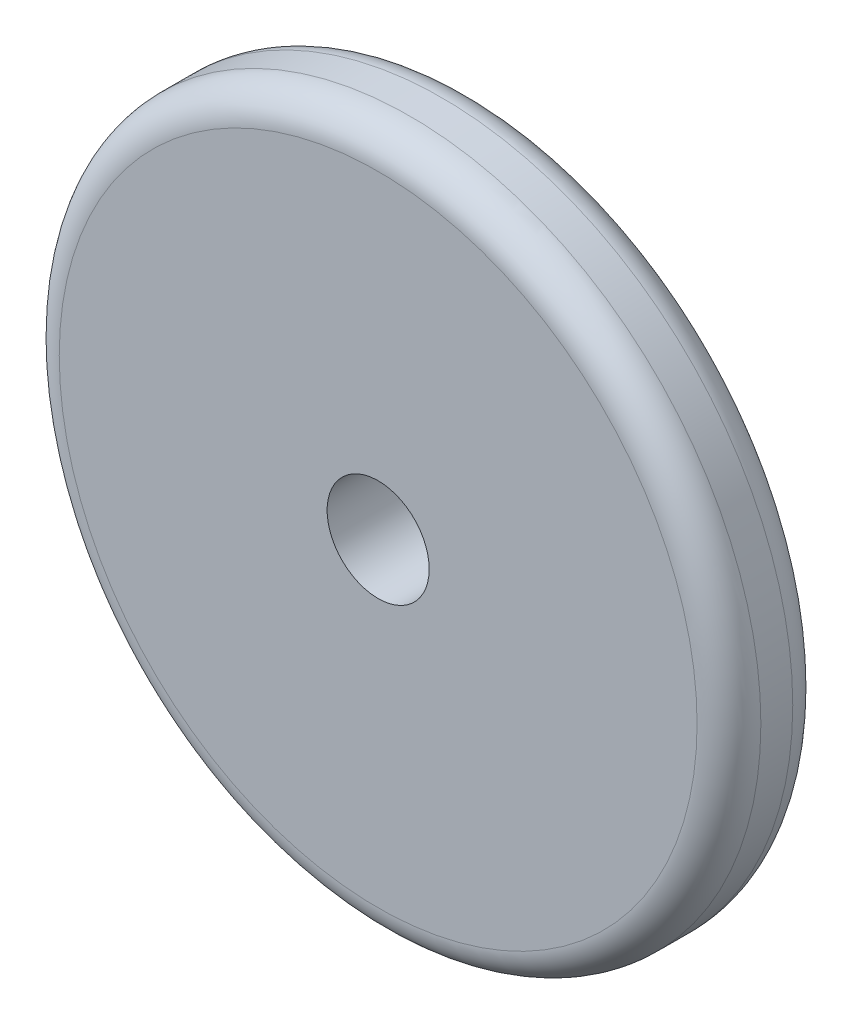
ISO-10303-21;
HEADER;
FILE_DESCRIPTION(('STEP AP214'),'2;1');
FILE_NAME('part.step','',(''),(''),'','','');
FILE_SCHEMA(('AUTOMOTIVE_DESIGN { 1 0 10303 214 1 1 1 1 }'));
ENDSEC;
DATA;
#1=APPLICATION_CONTEXT('core data for automotive mechanical design processes');
#2=APPLICATION_PROTOCOL_DEFINITION('international standard','automotive_design',2000,#1);
#3=PRODUCT_CONTEXT('',#1,'mechanical');
#4=PRODUCT('Part','Part','',(#3));
#5=PRODUCT_RELATED_PRODUCT_CATEGORY('part','',(#4));
#6=PRODUCT_DEFINITION_FORMATION('','',#4);
#7=PRODUCT_DEFINITION_CONTEXT('part definition',#1,'design');
#8=PRODUCT_DEFINITION('design','',#6,#7);
#9=PRODUCT_DEFINITION_SHAPE('','',#8);
#10=(LENGTH_UNIT() NAMED_UNIT(*) SI_UNIT(.MILLI.,.METRE.));
#11=(NAMED_UNIT(*) PLANE_ANGLE_UNIT() SI_UNIT($,.RADIAN.));
#12=(NAMED_UNIT(*) SI_UNIT($,.STERADIAN.) SOLID_ANGLE_UNIT());
#13=UNCERTAINTY_MEASURE_WITH_UNIT(LENGTH_MEASURE(1.E-05),#10,'distance_accuracy_value','');
#14=(GEOMETRIC_REPRESENTATION_CONTEXT(3) GLOBAL_UNCERTAINTY_ASSIGNED_CONTEXT((#13)) GLOBAL_UNIT_ASSIGNED_CONTEXT((#10,
#11,#12)) REPRESENTATION_CONTEXT('',''));
#15=CARTESIAN_POINT('',(0.,0.,0.));
#16=DIRECTION('',(0.,0.,1.));
#17=DIRECTION('',(1.,0.,0.));
#18=AXIS2_PLACEMENT_3D('',#15,#16,#17);
#19=CARTESIAN_POINT('',(0.,0.,3.));
#20=DIRECTION('',(0.,0.,1.));
#21=DIRECTION('',(1.,0.,0.));
#22=AXIS2_PLACEMENT_3D('',#19,#20,#21);
#23=PLANE('',#22);
#24=CARTESIAN_POINT('',(0.,0.,3.));
#25=DIRECTION('',(0.,0.,1.));
#26=DIRECTION('',(1.,0.,0.));
#27=AXIS2_PLACEMENT_3D('',#24,#25,#26);
#28=CIRCLE('',#27,10.);
#29=CARTESIAN_POINT('',(10.,0.,3.));
#30=VERTEX_POINT('',#29);
#31=EDGE_CURVE('E10',#30,#30,#28,.T.);
#32=ORIENTED_EDGE('',*,*,#31,.T.);
#33=EDGE_LOOP('',(#32));
#34=FACE_BOUND('',#33,.T.);
#35=CARTESIAN_POINT('',(0.,0.,3.));
#36=DIRECTION('',(0.,0.,1.));
#37=DIRECTION('',(1.,0.,0.));
#38=AXIS2_PLACEMENT_3D('',#35,#36,#37);
#39=CIRCLE('',#38,1.6);
#40=CARTESIAN_POINT('',(1.6,0.,3.));
#41=VERTEX_POINT('',#40);
#42=EDGE_CURVE('E59',#41,#41,#39,.T.);
#43=ORIENTED_EDGE('',*,*,#42,.F.);
#44=EDGE_LOOP('',(#43));
#45=FACE_BOUND('',#44,.T.);
#46=ADVANCED_FACE('F39',(#34,#45),#23,.T.);
#47=CARTESIAN_POINT('',(0.,0.,0.));
#48=DIRECTION('',(0.,0.,1.));
#49=DIRECTION('',(1.,0.,0.));
#50=AXIS2_PLACEMENT_3D('',#47,#48,#49);
#51=PLANE('',#50);
#52=CARTESIAN_POINT('',(0.,0.,0.));
#53=DIRECTION('',(0.,0.,1.));
#54=DIRECTION('',(1.,0.,0.));
#55=AXIS2_PLACEMENT_3D('',#52,#53,#54);
#56=CIRCLE('',#55,10.);
#57=CARTESIAN_POINT('',(10.,0.,0.));
#58=VERTEX_POINT('',#57);
#59=EDGE_CURVE('E46',#58,#58,#56,.F.);
#60=ORIENTED_EDGE('',*,*,#59,.T.);
#61=EDGE_LOOP('',(#60));
#62=FACE_BOUND('',#61,.T.);
#63=CARTESIAN_POINT('',(0.,0.,0.));
#64=DIRECTION('',(0.,0.,1.));
#65=DIRECTION('',(1.,0.,0.));
#66=AXIS2_PLACEMENT_3D('',#63,#64,#65);
#67=CIRCLE('',#66,1.6);
#68=CARTESIAN_POINT('',(1.6,0.,0.));
#69=VERTEX_POINT('',#68);
#70=EDGE_CURVE('E60',#69,#69,#67,.T.);
#71=ORIENTED_EDGE('',*,*,#70,.T.);
#72=EDGE_LOOP('',(#71));
#73=FACE_BOUND('',#72,.T.);
#74=ADVANCED_FACE('F70',(#62,#73),#51,.F.);
#75=CARTESIAN_POINT('',(0.,0.,3.));
#76=DIRECTION('',(0.,0.,-1.));
#77=DIRECTION('',(-1.,0.,0.));
#78=AXIS2_PLACEMENT_3D('',#75,#76,#77);
#79=CYLINDRICAL_SURFACE('',#78,11.);
#80=CARTESIAN_POINT('',(0.,0.,1.));
#81=DIRECTION('',(0.,0.,1.));
#82=DIRECTION('',(1.,0.,0.));
#83=AXIS2_PLACEMENT_3D('',#80,#81,#82);
#84=CIRCLE('',#83,11.);
#85=CARTESIAN_POINT('',(11.,0.,1.));
#86=VERTEX_POINT('',#85);
#87=EDGE_CURVE('E50',#86,#86,#84,.T.);
#88=ORIENTED_EDGE('',*,*,#87,.T.);
#89=EDGE_LOOP('',(#88));
#90=FACE_BOUND('',#89,.T.);
#91=CARTESIAN_POINT('',(0.,0.,2.));
#92=DIRECTION('',(0.,0.,1.));
#93=DIRECTION('',(1.,0.,0.));
#94=AXIS2_PLACEMENT_3D('',#91,#92,#93);
#95=CIRCLE('',#94,11.);
#96=CARTESIAN_POINT('',(11.,0.,2.));
#97=VERTEX_POINT('',#96);
#98=EDGE_CURVE('E54',#97,#97,#95,.F.);
#99=ORIENTED_EDGE('',*,*,#98,.T.);
#100=EDGE_LOOP('',(#99));
#101=FACE_BOUND('',#100,.T.);
#102=ADVANCED_FACE('F76',(#90,#101),#79,.T.);
#103=CARTESIAN_POINT('',(0.,0.,3.));
#104=DIRECTION('',(0.,0.,-1.));
#105=DIRECTION('',(-1.,0.,0.));
#106=AXIS2_PLACEMENT_3D('',#103,#104,#105);
#107=CYLINDRICAL_SURFACE('',#106,1.6);
#108=ORIENTED_EDGE('',*,*,#42,.T.);
#109=EDGE_LOOP('',(#108));
#110=FACE_BOUND('',#109,.T.);
#111=ORIENTED_EDGE('',*,*,#70,.F.);
#112=EDGE_LOOP('',(#111));
#113=FACE_BOUND('',#112,.T.);
#114=ADVANCED_FACE('F66',(#110,#113),#107,.F.);
#115=CARTESIAN_POINT('',(0.,0.,1.));
#116=DIRECTION('',(0.,0.,1.));
#117=DIRECTION('',(1.,0.,0.));
#118=AXIS2_PLACEMENT_3D('',#115,#116,#117);
#119=TOROIDAL_SURFACE('',#118,10.,1.);
#120=ORIENTED_EDGE('',*,*,#59,.F.);
#121=EDGE_LOOP('',(#120));
#122=FACE_BOUND('',#121,.T.);
#123=ORIENTED_EDGE('',*,*,#87,.F.);
#124=EDGE_LOOP('',(#123));
#125=FACE_BOUND('',#124,.T.);
#126=ADVANCED_FACE('F82',(#122,#125),#119,.T.);
#127=CARTESIAN_POINT('',(0.,0.,2.));
#128=DIRECTION('',(0.,0.,1.));
#129=DIRECTION('',(1.,0.,0.));
#130=AXIS2_PLACEMENT_3D('',#127,#128,#129);
#131=TOROIDAL_SURFACE('',#130,10.,1.);
#132=ORIENTED_EDGE('',*,*,#98,.F.);
#133=EDGE_LOOP('',(#132));
#134=FACE_BOUND('',#133,.T.);
#135=ORIENTED_EDGE('',*,*,#31,.F.);
#136=EDGE_LOOP('',(#135));
#137=FACE_BOUND('',#136,.T.);
#138=ADVANCED_FACE('F41',(#134,#137),#131,.T.);
#139=CLOSED_SHELL('',(#46,#74,#102,#114,#126,#138));
#140=MANIFOLD_SOLID_BREP('B2',#139);
#141=ADVANCED_BREP_SHAPE_REPRESENTATION('',(#18,#140),#14);
#142=SHAPE_DEFINITION_REPRESENTATION(#9,#141);
ENDSEC;
END-ISO-10303-21;
